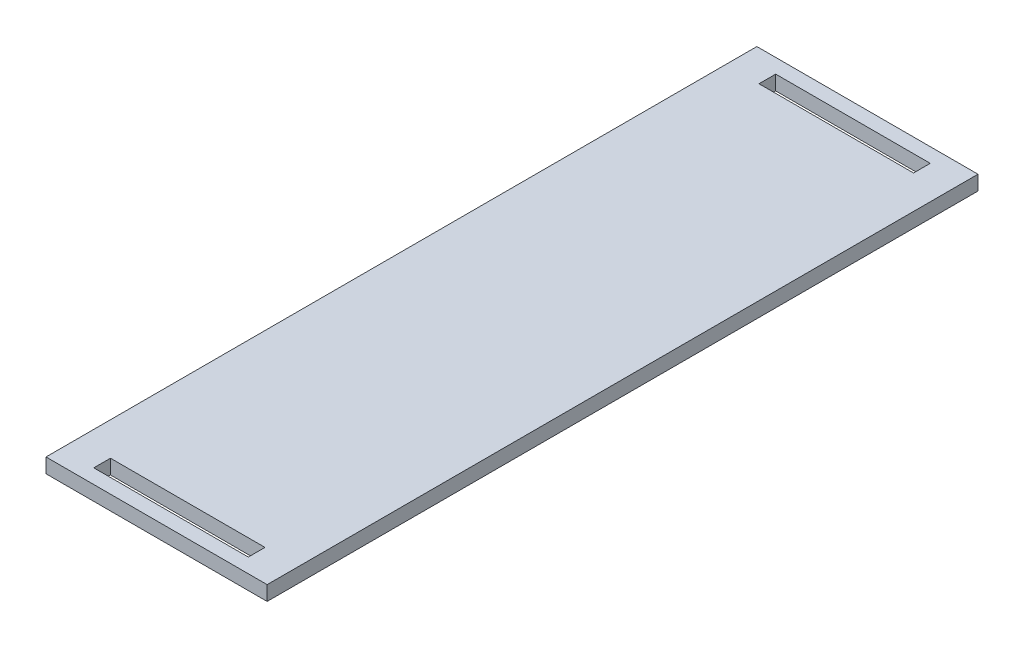
ISO-10303-21;
HEADER;
FILE_DESCRIPTION(('STEP AP214'),'2;1');
FILE_NAME('part.step','',(''),(''),'','','');
FILE_SCHEMA(('AUTOMOTIVE_DESIGN { 1 0 10303 214 1 1 1 1 }'));
ENDSEC;
DATA;
#1=APPLICATION_CONTEXT('core data for automotive mechanical design processes');
#2=APPLICATION_PROTOCOL_DEFINITION('international standard','automotive_design',2000,#1);
#3=PRODUCT_CONTEXT('',#1,'mechanical');
#4=PRODUCT('Part','Part','',(#3));
#5=PRODUCT_RELATED_PRODUCT_CATEGORY('part','',(#4));
#6=PRODUCT_DEFINITION_FORMATION('','',#4);
#7=PRODUCT_DEFINITION_CONTEXT('part definition',#1,'design');
#8=PRODUCT_DEFINITION('design','',#6,#7);
#9=PRODUCT_DEFINITION_SHAPE('','',#8);
#10=(LENGTH_UNIT() NAMED_UNIT(*) SI_UNIT(.MILLI.,.METRE.));
#11=(NAMED_UNIT(*) PLANE_ANGLE_UNIT() SI_UNIT($,.RADIAN.));
#12=(NAMED_UNIT(*) SI_UNIT($,.STERADIAN.) SOLID_ANGLE_UNIT());
#13=UNCERTAINTY_MEASURE_WITH_UNIT(LENGTH_MEASURE(1.E-05),#10,'distance_accuracy_value','');
#14=(GEOMETRIC_REPRESENTATION_CONTEXT(3) GLOBAL_UNCERTAINTY_ASSIGNED_CONTEXT((#13)) GLOBAL_UNIT_ASSIGNED_CONTEXT((#10,
#11,#12)) REPRESENTATION_CONTEXT('',''));
#15=CARTESIAN_POINT('',(0.,0.,0.));
#16=DIRECTION('',(0.,0.,1.));
#17=DIRECTION('',(1.,0.,0.));
#18=AXIS2_PLACEMENT_3D('',#15,#16,#17);
#19=CARTESIAN_POINT('',(0.,2.9972,66.6242));
#20=DIRECTION('',(0.,0.,-1.));
#21=DIRECTION('',(-1.,0.,0.));
#22=AXIS2_PLACEMENT_3D('',#19,#20,#21);
#23=PLANE('',#22);
#24=DIRECTION('',(1.,0.,0.));
#25=VECTOR('',#24,1.);
#26=CARTESIAN_POINT('',(0.,0.,66.6242));
#27=LINE('',#26,#25);
#28=CARTESIAN_POINT('',(-15.875,0.,66.6242));
#29=VERTEX_POINT('',#28);
#30=CARTESIAN_POINT('',(15.875,0.,66.6242));
#31=VERTEX_POINT('',#30);
#32=EDGE_CURVE('E197',#29,#31,#27,.T.);
#33=ORIENTED_EDGE('',*,*,#32,.T.);
#34=DIRECTION('',(0.,-1.,0.));
#35=VECTOR('',#34,1.);
#36=CARTESIAN_POINT('',(15.875,2.9972,66.6242));
#37=LINE('',#36,#35);
#38=CARTESIAN_POINT('',(15.875,2.9972,66.6242));
#39=VERTEX_POINT('',#38);
#40=EDGE_CURVE('E11',#39,#31,#37,.T.);
#41=ORIENTED_EDGE('',*,*,#40,.F.);
#42=DIRECTION('',(1.,0.,0.));
#43=VECTOR('',#42,1.);
#44=CARTESIAN_POINT('',(0.,2.9972,66.6242));
#45=LINE('',#44,#43);
#46=CARTESIAN_POINT('',(-15.875,2.9972,66.6242));
#47=VERTEX_POINT('',#46);
#48=EDGE_CURVE('E145',#47,#39,#45,.T.);
#49=ORIENTED_EDGE('',*,*,#48,.F.);
#50=DIRECTION('',(0.,-1.,0.));
#51=VECTOR('',#50,1.);
#52=CARTESIAN_POINT('',(-15.875,2.9972,66.6242));
#53=LINE('',#52,#51);
#54=EDGE_CURVE('E61',#47,#29,#53,.T.);
#55=ORIENTED_EDGE('',*,*,#54,.T.);
#56=EDGE_LOOP('',(#33,#41,#49,#55));
#57=FACE_BOUND('',#56,.T.);
#58=ADVANCED_FACE('F41',(#57),#23,.F.);
#59=CARTESIAN_POINT('',(15.8750000000001,2.9972,0.));
#60=DIRECTION('',(1.,0.,0.));
#61=DIRECTION('',(0.,0.,-1.));
#62=AXIS2_PLACEMENT_3D('',#59,#60,#61);
#63=PLANE('',#62);
#64=DIRECTION('',(0.,0.,1.));
#65=VECTOR('',#64,1.);
#66=CARTESIAN_POINT('',(15.8750000000001,0.,0.));
#67=LINE('',#66,#65);
#68=CARTESIAN_POINT('',(15.875,0.,70.0532));
#69=VERTEX_POINT('',#68);
#70=EDGE_CURVE('E152',#31,#69,#67,.T.);
#71=ORIENTED_EDGE('',*,*,#70,.T.);
#72=DIRECTION('',(0.,-1.,0.));
#73=VECTOR('',#72,1.);
#74=CARTESIAN_POINT('',(15.875,2.9972,70.0532));
#75=LINE('',#74,#73);
#76=CARTESIAN_POINT('',(15.875,2.9972,70.0532));
#77=VERTEX_POINT('',#76);
#78=EDGE_CURVE('E52',#77,#69,#75,.T.);
#79=ORIENTED_EDGE('',*,*,#78,.F.);
#80=DIRECTION('',(0.,0.,1.));
#81=VECTOR('',#80,1.);
#82=CARTESIAN_POINT('',(15.8750000000001,2.9972,0.));
#83=LINE('',#82,#81);
#84=EDGE_CURVE('E139',#39,#77,#83,.T.);
#85=ORIENTED_EDGE('',*,*,#84,.F.);
#86=ORIENTED_EDGE('',*,*,#40,.T.);
#87=EDGE_LOOP('',(#71,#79,#85,#86));
#88=FACE_BOUND('',#87,.T.);
#89=ADVANCED_FACE('F151',(#88),#63,.F.);
#90=CARTESIAN_POINT('',(0.,2.9972,70.0532));
#91=DIRECTION('',(0.,0.,-1.));
#92=DIRECTION('',(-1.,0.,0.));
#93=AXIS2_PLACEMENT_3D('',#90,#91,#92);
#94=PLANE('',#93);
#95=DIRECTION('',(1.,0.,0.));
#96=VECTOR('',#95,1.);
#97=CARTESIAN_POINT('',(0.,0.,70.0532));
#98=LINE('',#97,#96);
#99=CARTESIAN_POINT('',(-15.875,0.,70.0532));
#100=VERTEX_POINT('',#99);
#101=EDGE_CURVE('E202',#100,#69,#98,.T.);
#102=ORIENTED_EDGE('',*,*,#101,.F.);
#103=DIRECTION('',(0.,-1.,0.));
#104=VECTOR('',#103,1.);
#105=CARTESIAN_POINT('',(-15.875,2.9972,70.0532));
#106=LINE('',#105,#104);
#107=CARTESIAN_POINT('',(-15.875,2.9972,70.0532));
#108=VERTEX_POINT('',#107);
#109=EDGE_CURVE('E99',#108,#100,#106,.T.);
#110=ORIENTED_EDGE('',*,*,#109,.F.);
#111=DIRECTION('',(1.,0.,0.));
#112=VECTOR('',#111,1.);
#113=CARTESIAN_POINT('',(0.,2.9972,70.0532));
#114=LINE('',#113,#112);
#115=EDGE_CURVE('E144',#108,#77,#114,.T.);
#116=ORIENTED_EDGE('',*,*,#115,.T.);
#117=ORIENTED_EDGE('',*,*,#78,.T.);
#118=EDGE_LOOP('',(#102,#110,#116,#117));
#119=FACE_BOUND('',#118,.T.);
#120=ADVANCED_FACE('F157',(#119),#94,.T.);
#121=CARTESIAN_POINT('',(0.,2.9972,-70.0532));
#122=DIRECTION('',(0.,0.,-1.));
#123=DIRECTION('',(-1.,0.,0.));
#124=AXIS2_PLACEMENT_3D('',#121,#122,#123);
#125=PLANE('',#124);
#126=DIRECTION('',(1.,0.,0.));
#127=VECTOR('',#126,1.);
#128=CARTESIAN_POINT('',(0.,0.,-70.0532));
#129=LINE('',#128,#127);
#130=CARTESIAN_POINT('',(-15.875,0.,-70.0532));
#131=VERTEX_POINT('',#130);
#132=CARTESIAN_POINT('',(15.875,0.,-70.0532));
#133=VERTEX_POINT('',#132);
#134=EDGE_CURVE('E181',#131,#133,#129,.T.);
#135=ORIENTED_EDGE('',*,*,#134,.T.);
#136=DIRECTION('',(0.,-1.,0.));
#137=VECTOR('',#136,1.);
#138=CARTESIAN_POINT('',(15.875,2.9972,-70.0532));
#139=LINE('',#138,#137);
#140=CARTESIAN_POINT('',(15.875,2.9972,-70.0532));
#141=VERTEX_POINT('',#140);
#142=EDGE_CURVE('E212',#141,#133,#139,.T.);
#143=ORIENTED_EDGE('',*,*,#142,.F.);
#144=DIRECTION('',(1.,0.,0.));
#145=VECTOR('',#144,1.);
#146=CARTESIAN_POINT('',(0.,2.9972,-70.0532));
#147=LINE('',#146,#145);
#148=CARTESIAN_POINT('',(-15.875,2.9972,-70.0532));
#149=VERTEX_POINT('',#148);
#150=EDGE_CURVE('E257',#149,#141,#147,.T.);
#151=ORIENTED_EDGE('',*,*,#150,.F.);
#152=DIRECTION('',(0.,-1.,0.));
#153=VECTOR('',#152,1.);
#154=CARTESIAN_POINT('',(-15.875,2.9972,-70.0532));
#155=LINE('',#154,#153);
#156=EDGE_CURVE('E215',#149,#131,#155,.T.);
#157=ORIENTED_EDGE('',*,*,#156,.T.);
#158=EDGE_LOOP('',(#135,#143,#151,#157));
#159=FACE_BOUND('',#158,.T.);
#160=ADVANCED_FACE('F293',(#159),#125,.F.);
#161=CARTESIAN_POINT('',(15.875,2.9972,0.));
#162=DIRECTION('',(1.,0.,0.));
#163=DIRECTION('',(0.,0.,-1.));
#164=AXIS2_PLACEMENT_3D('',#161,#162,#163);
#165=PLANE('',#164);
#166=DIRECTION('',(0.,0.,1.));
#167=VECTOR('',#166,1.);
#168=CARTESIAN_POINT('',(15.875,0.,0.));
#169=LINE('',#168,#167);
#170=CARTESIAN_POINT('',(15.875,0.,-66.6242));
#171=VERTEX_POINT('',#170);
#172=EDGE_CURVE('E185',#133,#171,#169,.T.);
#173=ORIENTED_EDGE('',*,*,#172,.T.);
#174=DIRECTION('',(0.,-1.,0.));
#175=VECTOR('',#174,1.);
#176=CARTESIAN_POINT('',(15.875,2.9972,-66.6242));
#177=LINE('',#176,#175);
#178=CARTESIAN_POINT('',(15.875,2.9972,-66.6242));
#179=VERTEX_POINT('',#178);
#180=EDGE_CURVE('E221',#179,#171,#177,.T.);
#181=ORIENTED_EDGE('',*,*,#180,.F.);
#182=DIRECTION('',(0.,0.,1.));
#183=VECTOR('',#182,1.);
#184=CARTESIAN_POINT('',(15.875,2.9972,0.));
#185=LINE('',#184,#183);
#186=EDGE_CURVE('E263',#141,#179,#185,.T.);
#187=ORIENTED_EDGE('',*,*,#186,.F.);
#188=ORIENTED_EDGE('',*,*,#142,.T.);
#189=EDGE_LOOP('',(#173,#181,#187,#188));
#190=FACE_BOUND('',#189,.T.);
#191=ADVANCED_FACE('F295',(#190),#165,.F.);
#192=CARTESIAN_POINT('',(0.,2.9972,-66.6242));
#193=DIRECTION('',(0.,0.,-1.));
#194=DIRECTION('',(-1.,0.,0.));
#195=AXIS2_PLACEMENT_3D('',#192,#193,#194);
#196=PLANE('',#195);
#197=DIRECTION('',(1.,0.,0.));
#198=VECTOR('',#197,1.);
#199=CARTESIAN_POINT('',(0.,0.,-66.6242));
#200=LINE('',#199,#198);
#201=CARTESIAN_POINT('',(-15.875,0.,-66.6242));
#202=VERTEX_POINT('',#201);
#203=EDGE_CURVE('E189',#202,#171,#200,.T.);
#204=ORIENTED_EDGE('',*,*,#203,.F.);
#205=DIRECTION('',(0.,-1.,0.));
#206=VECTOR('',#205,1.);
#207=CARTESIAN_POINT('',(-15.875,2.9972,-66.6242));
#208=LINE('',#207,#206);
#209=CARTESIAN_POINT('',(-15.875,2.9972,-66.6242));
#210=VERTEX_POINT('',#209);
#211=EDGE_CURVE('E218',#210,#202,#208,.T.);
#212=ORIENTED_EDGE('',*,*,#211,.F.);
#213=DIRECTION('',(1.,0.,0.));
#214=VECTOR('',#213,1.);
#215=CARTESIAN_POINT('',(0.,2.9972,-66.6242));
#216=LINE('',#215,#214);
#217=EDGE_CURVE('E270',#210,#179,#216,.T.);
#218=ORIENTED_EDGE('',*,*,#217,.T.);
#219=ORIENTED_EDGE('',*,*,#180,.T.);
#220=EDGE_LOOP('',(#204,#212,#218,#219));
#221=FACE_BOUND('',#220,.T.);
#222=ADVANCED_FACE('F289',(#221),#196,.T.);
#223=CARTESIAN_POINT('',(-22.7168455999999,2.9972,0.));
#224=DIRECTION('',(-1.,0.,0.));
#225=DIRECTION('',(0.,0.,1.));
#226=AXIS2_PLACEMENT_3D('',#223,#224,#225);
#227=PLANE('',#226);
#228=DIRECTION('',(0.,0.,-1.));
#229=VECTOR('',#228,1.);
#230=CARTESIAN_POINT('',(-22.7168455999999,0.,0.));
#231=LINE('',#230,#229);
#232=CARTESIAN_POINT('',(-22.7168455999999,0.,73.025));
#233=VERTEX_POINT('',#232);
#234=CARTESIAN_POINT('',(-22.7168455999999,0.,-73.025));
#235=VERTEX_POINT('',#234);
#236=EDGE_CURVE('E166',#233,#235,#231,.T.);
#237=ORIENTED_EDGE('',*,*,#236,.F.);
#238=DIRECTION('',(0.,-1.,0.));
#239=VECTOR('',#238,1.);
#240=CARTESIAN_POINT('',(-22.7168455999999,2.9972,73.025));
#241=LINE('',#240,#239);
#242=CARTESIAN_POINT('',(-22.7168455999999,2.9972,73.025));
#243=VERTEX_POINT('',#242);
#244=EDGE_CURVE('E45',#243,#233,#241,.T.);
#245=ORIENTED_EDGE('',*,*,#244,.F.);
#246=DIRECTION('',(0.,0.,-1.));
#247=VECTOR('',#246,1.);
#248=CARTESIAN_POINT('',(-22.7168455999999,2.9972,0.));
#249=LINE('',#248,#247);
#250=CARTESIAN_POINT('',(-22.7168455999999,2.9972,-73.025));
#251=VERTEX_POINT('',#250);
#252=EDGE_CURVE('E209',#243,#251,#249,.T.);
#253=ORIENTED_EDGE('',*,*,#252,.T.);
#254=DIRECTION('',(0.,-1.,0.));
#255=VECTOR('',#254,1.);
#256=CARTESIAN_POINT('',(-22.7168455999999,2.9972,-73.025));
#257=LINE('',#256,#255);
#258=EDGE_CURVE('E162',#251,#235,#257,.T.);
#259=ORIENTED_EDGE('',*,*,#258,.T.);
#260=EDGE_LOOP('',(#237,#245,#253,#259));
#261=FACE_BOUND('',#260,.T.);
#262=ADVANCED_FACE('F43',(#261),#227,.T.);
#263=CARTESIAN_POINT('',(0.,2.9972,73.025));
#264=DIRECTION('',(0.,0.,1.));
#265=DIRECTION('',(1.,0.,0.));
#266=AXIS2_PLACEMENT_3D('',#263,#264,#265);
#267=PLANE('',#266);
#268=DIRECTION('',(-1.,0.,0.));
#269=VECTOR('',#268,1.);
#270=CARTESIAN_POINT('',(0.,0.,73.025));
#271=LINE('',#270,#269);
#272=CARTESIAN_POINT('',(22.7168456000001,0.,73.025));
#273=VERTEX_POINT('',#272);
#274=EDGE_CURVE('E170',#273,#233,#271,.T.);
#275=ORIENTED_EDGE('',*,*,#274,.F.);
#276=DIRECTION('',(0.,-1.,0.));
#277=VECTOR('',#276,1.);
#278=CARTESIAN_POINT('',(22.7168456000001,2.9972,73.025));
#279=LINE('',#278,#277);
#280=CARTESIAN_POINT('',(22.7168456000001,2.9972,73.025));
#281=VERTEX_POINT('',#280);
#282=EDGE_CURVE('E232',#281,#273,#279,.T.);
#283=ORIENTED_EDGE('',*,*,#282,.F.);
#284=DIRECTION('',(-1.,0.,0.));
#285=VECTOR('',#284,1.);
#286=CARTESIAN_POINT('',(0.,2.9972,73.025));
#287=LINE('',#286,#285);
#288=EDGE_CURVE('E243',#281,#243,#287,.T.);
#289=ORIENTED_EDGE('',*,*,#288,.T.);
#290=ORIENTED_EDGE('',*,*,#244,.T.);
#291=EDGE_LOOP('',(#275,#283,#289,#290));
#292=FACE_BOUND('',#291,.T.);
#293=ADVANCED_FACE('F241',(#292),#267,.T.);
#294=CARTESIAN_POINT('',(22.7168456000001,2.9972,0.));
#295=DIRECTION('',(-1.,0.,0.));
#296=DIRECTION('',(0.,0.,1.));
#297=AXIS2_PLACEMENT_3D('',#294,#295,#296);
#298=PLANE('',#297);
#299=DIRECTION('',(0.,0.,-1.));
#300=VECTOR('',#299,1.);
#301=CARTESIAN_POINT('',(22.7168456000001,0.,0.));
#302=LINE('',#301,#300);
#303=CARTESIAN_POINT('',(22.7168456000001,0.,-73.025));
#304=VERTEX_POINT('',#303);
#305=EDGE_CURVE('E174',#273,#304,#302,.T.);
#306=ORIENTED_EDGE('',*,*,#305,.T.);
#307=DIRECTION('',(0.,-1.,0.));
#308=VECTOR('',#307,1.);
#309=CARTESIAN_POINT('',(22.7168456000001,2.9972,-73.025));
#310=LINE('',#309,#308);
#311=CARTESIAN_POINT('',(22.7168456000001,2.9972,-73.025));
#312=VERTEX_POINT('',#311);
#313=EDGE_CURVE('E229',#312,#304,#310,.T.);
#314=ORIENTED_EDGE('',*,*,#313,.F.);
#315=DIRECTION('',(0.,0.,-1.));
#316=VECTOR('',#315,1.);
#317=CARTESIAN_POINT('',(22.7168456000001,2.9972,0.));
#318=LINE('',#317,#316);
#319=EDGE_CURVE('E258',#281,#312,#318,.T.);
#320=ORIENTED_EDGE('',*,*,#319,.F.);
#321=ORIENTED_EDGE('',*,*,#282,.T.);
#322=EDGE_LOOP('',(#306,#314,#320,#321));
#323=FACE_BOUND('',#322,.T.);
#324=ADVANCED_FACE('F250',(#323),#298,.F.);
#325=CARTESIAN_POINT('',(-15.875,2.9972,0.));
#326=DIRECTION('',(1.,0.,0.));
#327=DIRECTION('',(0.,0.,-1.));
#328=AXIS2_PLACEMENT_3D('',#325,#326,#327);
#329=PLANE('',#328);
#330=DIRECTION('',(0.,0.,1.));
#331=VECTOR('',#330,1.);
#332=CARTESIAN_POINT('',(-15.875,0.,0.));
#333=LINE('',#332,#331);
#334=EDGE_CURVE('E193',#131,#202,#333,.T.);
#335=ORIENTED_EDGE('',*,*,#334,.F.);
#336=ORIENTED_EDGE('',*,*,#156,.F.);
#337=DIRECTION('',(0.,0.,1.));
#338=VECTOR('',#337,1.);
#339=CARTESIAN_POINT('',(-15.875,2.9972,0.));
#340=LINE('',#339,#338);
#341=EDGE_CURVE('E274',#149,#210,#340,.T.);
#342=ORIENTED_EDGE('',*,*,#341,.T.);
#343=ORIENTED_EDGE('',*,*,#211,.T.);
#344=EDGE_LOOP('',(#335,#336,#342,#343));
#345=FACE_BOUND('',#344,.T.);
#346=ADVANCED_FACE('F281',(#345),#329,.T.);
#347=CARTESIAN_POINT('',(0.,2.9972,-73.025));
#348=DIRECTION('',(0.,0.,1.));
#349=DIRECTION('',(1.,0.,0.));
#350=AXIS2_PLACEMENT_3D('',#347,#348,#349);
#351=PLANE('',#350);
#352=DIRECTION('',(-1.,0.,0.));
#353=VECTOR('',#352,1.);
#354=CARTESIAN_POINT('',(0.,0.,-73.025));
#355=LINE('',#354,#353);
#356=EDGE_CURVE('E177',#304,#235,#355,.T.);
#357=ORIENTED_EDGE('',*,*,#356,.T.);
#358=ORIENTED_EDGE('',*,*,#258,.F.);
#359=DIRECTION('',(-1.,0.,0.));
#360=VECTOR('',#359,1.);
#361=CARTESIAN_POINT('',(0.,2.9972,-73.025));
#362=LINE('',#361,#360);
#363=EDGE_CURVE('E254',#312,#251,#362,.T.);
#364=ORIENTED_EDGE('',*,*,#363,.F.);
#365=ORIENTED_EDGE('',*,*,#313,.T.);
#366=EDGE_LOOP('',(#357,#358,#364,#365));
#367=FACE_BOUND('',#366,.T.);
#368=ADVANCED_FACE('F253',(#367),#351,.F.);
#369=CARTESIAN_POINT('',(-15.8750000000001,2.9972,0.));
#370=DIRECTION('',(1.,0.,0.));
#371=DIRECTION('',(0.,0.,-1.));
#372=AXIS2_PLACEMENT_3D('',#369,#370,#371);
#373=PLANE('',#372);
#374=DIRECTION('',(0.,0.,1.));
#375=VECTOR('',#374,1.);
#376=CARTESIAN_POINT('',(-15.8750000000001,0.,0.));
#377=LINE('',#376,#375);
#378=EDGE_CURVE('E205',#29,#100,#377,.T.);
#379=ORIENTED_EDGE('',*,*,#378,.F.);
#380=ORIENTED_EDGE('',*,*,#54,.F.);
#381=DIRECTION('',(0.,0.,1.));
#382=VECTOR('',#381,1.);
#383=CARTESIAN_POINT('',(-15.8750000000001,2.9972,0.));
#384=LINE('',#383,#382);
#385=EDGE_CURVE('E159',#47,#108,#384,.T.);
#386=ORIENTED_EDGE('',*,*,#385,.T.);
#387=ORIENTED_EDGE('',*,*,#109,.T.);
#388=EDGE_LOOP('',(#379,#380,#386,#387));
#389=FACE_BOUND('',#388,.T.);
#390=ADVANCED_FACE('F317',(#389),#373,.T.);
#391=CARTESIAN_POINT('',(0.,2.9972,0.));
#392=DIRECTION('',(0.,1.,0.));
#393=DIRECTION('',(0.,0.,1.));
#394=AXIS2_PLACEMENT_3D('',#391,#392,#393);
#395=PLANE('',#394);
#396=ORIENTED_EDGE('',*,*,#252,.F.);
#397=ORIENTED_EDGE('',*,*,#288,.F.);
#398=ORIENTED_EDGE('',*,*,#319,.T.);
#399=ORIENTED_EDGE('',*,*,#363,.T.);
#400=EDGE_LOOP('',(#396,#397,#398,#399));
#401=FACE_BOUND('',#400,.T.);
#402=ORIENTED_EDGE('',*,*,#150,.T.);
#403=ORIENTED_EDGE('',*,*,#186,.T.);
#404=ORIENTED_EDGE('',*,*,#217,.F.);
#405=ORIENTED_EDGE('',*,*,#341,.F.);
#406=EDGE_LOOP('',(#402,#403,#404,#405));
#407=FACE_BOUND('',#406,.T.);
#408=ORIENTED_EDGE('',*,*,#48,.T.);
#409=ORIENTED_EDGE('',*,*,#84,.T.);
#410=ORIENTED_EDGE('',*,*,#115,.F.);
#411=ORIENTED_EDGE('',*,*,#385,.F.);
#412=EDGE_LOOP('',(#408,#409,#410,#411));
#413=FACE_BOUND('',#412,.T.);
#414=ADVANCED_FACE('F141',(#401,#407,#413),#395,.T.);
#415=CARTESIAN_POINT('',(0.,0.,0.));
#416=DIRECTION('',(0.,1.,0.));
#417=DIRECTION('',(0.,0.,1.));
#418=AXIS2_PLACEMENT_3D('',#415,#416,#417);
#419=PLANE('',#418);
#420=ORIENTED_EDGE('',*,*,#236,.T.);
#421=ORIENTED_EDGE('',*,*,#356,.F.);
#422=ORIENTED_EDGE('',*,*,#305,.F.);
#423=ORIENTED_EDGE('',*,*,#274,.T.);
#424=EDGE_LOOP('',(#420,#421,#422,#423));
#425=FACE_BOUND('',#424,.T.);
#426=ORIENTED_EDGE('',*,*,#134,.F.);
#427=ORIENTED_EDGE('',*,*,#334,.T.);
#428=ORIENTED_EDGE('',*,*,#203,.T.);
#429=ORIENTED_EDGE('',*,*,#172,.F.);
#430=EDGE_LOOP('',(#426,#427,#428,#429));
#431=FACE_BOUND('',#430,.T.);
#432=ORIENTED_EDGE('',*,*,#32,.F.);
#433=ORIENTED_EDGE('',*,*,#378,.T.);
#434=ORIENTED_EDGE('',*,*,#101,.T.);
#435=ORIENTED_EDGE('',*,*,#70,.F.);
#436=EDGE_LOOP('',(#432,#433,#434,#435));
#437=FACE_BOUND('',#436,.T.);
#438=ADVANCED_FACE('F247',(#425,#431,#437),#419,.F.);
#439=CLOSED_SHELL('',(#58,#89,#120,#160,#191,#222,#262,#293,#324,#346,#368,#390,#414,#438));
#440=MANIFOLD_SOLID_BREP('B2',#439);
#441=ADVANCED_BREP_SHAPE_REPRESENTATION('',(#18,#440),#14);
#442=SHAPE_DEFINITION_REPRESENTATION(#9,#441);
ENDSEC;
END-ISO-10303-21;
